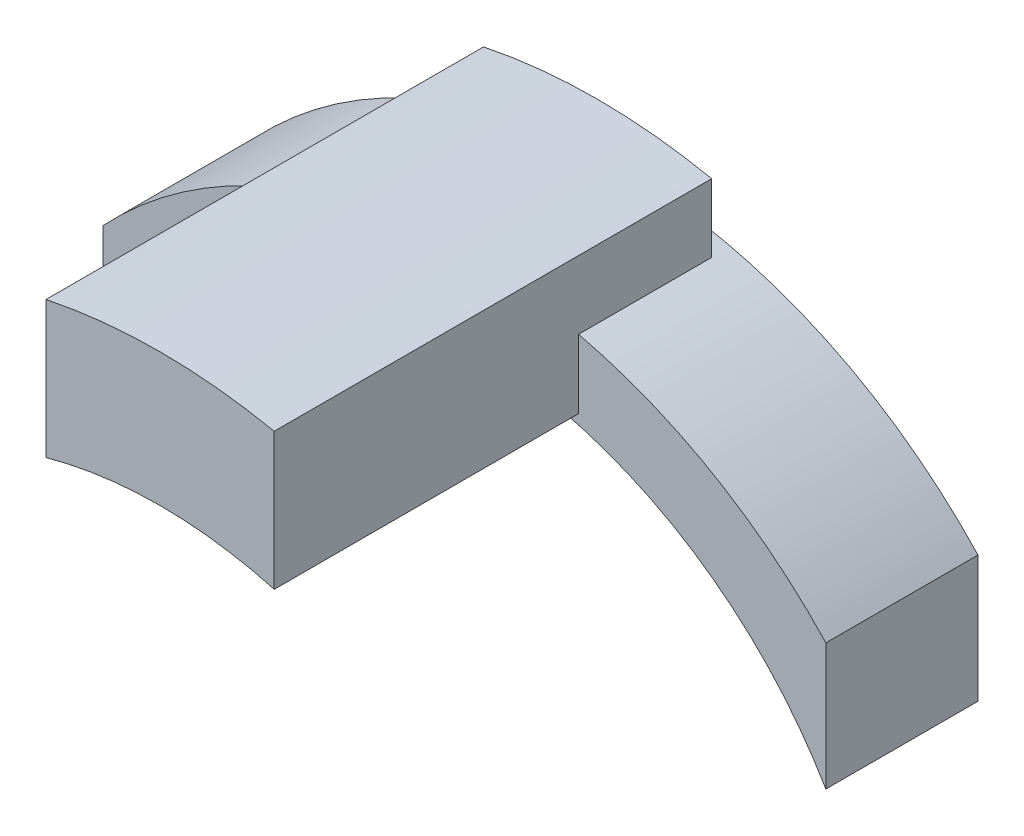
ISO-10303-21;
HEADER;
FILE_DESCRIPTION(('STEP AP214'),'2;1');
FILE_NAME('part.step','',(''),(''),'','','');
FILE_SCHEMA(('AUTOMOTIVE_DESIGN { 1 0 10303 214 1 1 1 1 }'));
ENDSEC;
DATA;
#1=APPLICATION_CONTEXT('core data for automotive mechanical design processes');
#2=APPLICATION_PROTOCOL_DEFINITION('international standard','automotive_design',2000,#1);
#3=PRODUCT_CONTEXT('',#1,'mechanical');
#4=PRODUCT('Part','Part','',(#3));
#5=PRODUCT_RELATED_PRODUCT_CATEGORY('part','',(#4));
#6=PRODUCT_DEFINITION_FORMATION('','',#4);
#7=PRODUCT_DEFINITION_CONTEXT('part definition',#1,'design');
#8=PRODUCT_DEFINITION('design','',#6,#7);
#9=PRODUCT_DEFINITION_SHAPE('','',#8);
#10=(LENGTH_UNIT() NAMED_UNIT(*) SI_UNIT(.MILLI.,.METRE.));
#11=(NAMED_UNIT(*) PLANE_ANGLE_UNIT() SI_UNIT($,.RADIAN.));
#12=(NAMED_UNIT(*) SI_UNIT($,.STERADIAN.) SOLID_ANGLE_UNIT());
#13=UNCERTAINTY_MEASURE_WITH_UNIT(LENGTH_MEASURE(1.E-05),#10,'distance_accuracy_value','');
#14=(GEOMETRIC_REPRESENTATION_CONTEXT(3) GLOBAL_UNCERTAINTY_ASSIGNED_CONTEXT((#13)) GLOBAL_UNIT_ASSIGNED_CONTEXT((#10,
#11,#12)) REPRESENTATION_CONTEXT('',''));
#15=CARTESIAN_POINT('',(0.,0.,0.));
#16=DIRECTION('',(0.,0.,1.));
#17=DIRECTION('',(1.,0.,0.));
#18=AXIS2_PLACEMENT_3D('',#15,#16,#17);
#19=CARTESIAN_POINT('',(0.,0.,4.));
#20=DIRECTION('',(0.,0.,-1.));
#21=DIRECTION('',(-1.,0.,0.));
#22=AXIS2_PLACEMENT_3D('',#19,#20,#21);
#23=CYLINDRICAL_SURFACE('',#22,26.);
#24=DIRECTION('',(0.,0.,-1.));
#25=VECTOR('',#24,1.);
#26=CARTESIAN_POINT('',(-5.99999999999999,25.298221281347,4.));
#27=LINE('',#26,#25);
#28=CARTESIAN_POINT('',(-5.99999999999999,25.298221281347,-3.));
#29=VERTEX_POINT('',#28);
#30=CARTESIAN_POINT('',(-5.99999999999999,25.298221281347,4.));
#31=VERTEX_POINT('',#30);
#32=EDGE_CURVE('E172',#29,#31,#27,.F.);
#33=ORIENTED_EDGE('',*,*,#32,.F.);
#34=CARTESIAN_POINT('',(0.,0.,-3.));
#35=DIRECTION('',(0.,0.,-1.));
#36=DIRECTION('',(-1.,0.,0.));
#37=AXIS2_PLACEMENT_3D('',#34,#35,#36);
#38=CIRCLE('',#37,26.);
#39=CARTESIAN_POINT('',(6.00000000000001,25.298221281347,-3.));
#40=VERTEX_POINT('',#39);
#41=EDGE_CURVE('E11',#29,#40,#38,.T.);
#42=ORIENTED_EDGE('',*,*,#41,.T.);
#43=DIRECTION('',(0.,0.,-1.));
#44=VECTOR('',#43,1.);
#45=CARTESIAN_POINT('',(6.00000000000001,25.298221281347,4.));
#46=LINE('',#45,#44);
#47=CARTESIAN_POINT('',(6.00000000000001,25.298221281347,4.));
#48=VERTEX_POINT('',#47);
#49=EDGE_CURVE('E142',#48,#40,#46,.T.);
#50=ORIENTED_EDGE('',*,*,#49,.F.);
#51=CARTESIAN_POINT('',(0.,0.,4.));
#52=DIRECTION('',(0.,0.,1.));
#53=DIRECTION('',(1.,0.,0.));
#54=AXIS2_PLACEMENT_3D('',#51,#52,#53);
#55=CIRCLE('',#54,26.);
#56=CARTESIAN_POINT('',(19.,17.7482393492988,4.));
#57=VERTEX_POINT('',#56);
#58=EDGE_CURVE('E179',#57,#48,#55,.T.);
#59=ORIENTED_EDGE('',*,*,#58,.F.);
#60=DIRECTION('',(0.,0.,-1.));
#61=VECTOR('',#60,1.);
#62=CARTESIAN_POINT('',(19.,17.7482393492988,4.));
#63=LINE('',#62,#61);
#64=CARTESIAN_POINT('',(19.,17.7482393492988,-4.));
#65=VERTEX_POINT('',#64);
#66=EDGE_CURVE('E194',#57,#65,#63,.T.);
#67=ORIENTED_EDGE('',*,*,#66,.T.);
#68=CARTESIAN_POINT('',(0.,0.,-4.));
#69=DIRECTION('',(0.,0.,1.));
#70=DIRECTION('',(1.,0.,0.));
#71=AXIS2_PLACEMENT_3D('',#68,#69,#70);
#72=CIRCLE('',#71,26.);
#73=CARTESIAN_POINT('',(-19.,17.7482393492988,-4.));
#74=VERTEX_POINT('',#73);
#75=EDGE_CURVE('E188',#65,#74,#72,.T.);
#76=ORIENTED_EDGE('',*,*,#75,.T.);
#77=DIRECTION('',(0.,0.,-1.));
#78=VECTOR('',#77,1.);
#79=CARTESIAN_POINT('',(-19.,17.7482393492988,4.));
#80=LINE('',#79,#78);
#81=CARTESIAN_POINT('',(-19.,17.7482393492988,4.));
#82=VERTEX_POINT('',#81);
#83=EDGE_CURVE('E192',#82,#74,#80,.T.);
#84=ORIENTED_EDGE('',*,*,#83,.F.);
#85=EDGE_CURVE('E178',#31,#82,#55,.T.);
#86=ORIENTED_EDGE('',*,*,#85,.F.);
#87=EDGE_LOOP('',(#33,#42,#50,#59,#67,#76,#84,#86));
#88=FACE_BOUND('',#87,.T.);
#89=ADVANCED_FACE('F44',(#88),#23,.T.);
#90=CARTESIAN_POINT('',(0.,0.,4.));
#91=DIRECTION('',(0.,0.,1.));
#92=DIRECTION('',(1.,0.,0.));
#93=AXIS2_PLACEMENT_3D('',#90,#91,#92);
#94=PLANE('',#93);
#95=CARTESIAN_POINT('',(0.,0.,4.));
#96=DIRECTION('',(0.,0.,1.));
#97=DIRECTION('',(1.,0.,0.));
#98=AXIS2_PLACEMENT_3D('',#95,#96,#97);
#99=CIRCLE('',#98,22.5);
#100=CARTESIAN_POINT('',(6.00000000000001,21.6852484422014,4.));
#101=VERTEX_POINT('',#100);
#102=CARTESIAN_POINT('',(-5.99999999999999,21.6852484422014,4.));
#103=VERTEX_POINT('',#102);
#104=EDGE_CURVE('E202',#101,#103,#99,.T.);
#105=ORIENTED_EDGE('',*,*,#104,.T.);
#106=DIRECTION('',(0.,1.,0.));
#107=VECTOR('',#106,1.);
#108=CARTESIAN_POINT('',(-5.99999999999999,0.,4.));
#109=LINE('',#108,#107);
#110=EDGE_CURVE('E53',#103,#31,#109,.T.);
#111=ORIENTED_EDGE('',*,*,#110,.T.);
#112=ORIENTED_EDGE('',*,*,#85,.T.);
#113=DIRECTION('',(0.,-1.,0.));
#114=VECTOR('',#113,1.);
#115=CARTESIAN_POINT('',(-19.,11.0905365064094,4.));
#116=LINE('',#115,#114);
#117=CARTESIAN_POINT('',(-19.,11.0905365064094,4.));
#118=VERTEX_POINT('',#117);
#119=EDGE_CURVE('E69',#82,#118,#116,.T.);
#120=ORIENTED_EDGE('',*,*,#119,.T.);
#121=CARTESIAN_POINT('',(0.,0.,4.));
#122=DIRECTION('',(0.,0.,-1.));
#123=DIRECTION('',(1.,0.,0.));
#124=AXIS2_PLACEMENT_3D('',#121,#122,#123);
#125=CIRCLE('',#124,22.);
#126=CARTESIAN_POINT('',(19.,11.0905365064094,4.));
#127=VERTEX_POINT('',#126);
#128=EDGE_CURVE('E175',#118,#127,#125,.T.);
#129=ORIENTED_EDGE('',*,*,#128,.T.);
#130=DIRECTION('',(0.,1.,0.));
#131=VECTOR('',#130,1.);
#132=CARTESIAN_POINT('',(19.,17.7482393492988,4.));
#133=LINE('',#132,#131);
#134=EDGE_CURVE('E98',#127,#57,#133,.T.);
#135=ORIENTED_EDGE('',*,*,#134,.T.);
#136=ORIENTED_EDGE('',*,*,#58,.T.);
#137=DIRECTION('',(0.,-1.,0.));
#138=VECTOR('',#137,1.);
#139=CARTESIAN_POINT('',(6.00000000000001,0.,4.));
#140=LINE('',#139,#138);
#141=EDGE_CURVE('E199',#48,#101,#140,.T.);
#142=ORIENTED_EDGE('',*,*,#141,.T.);
#143=EDGE_LOOP('',(#105,#111,#112,#120,#129,#135,#136,#142));
#144=FACE_BOUND('',#143,.T.);
#145=ADVANCED_FACE('F204',(#144),#94,.T.);
#146=CARTESIAN_POINT('',(0.,0.,4.));
#147=DIRECTION('',(0.,0.,-1.));
#148=DIRECTION('',(-1.,0.,0.));
#149=AXIS2_PLACEMENT_3D('',#146,#147,#148);
#150=CYLINDRICAL_SURFACE('',#149,22.);
#151=CARTESIAN_POINT('',(0.,0.,-4.));
#152=DIRECTION('',(0.,0.,-1.));
#153=DIRECTION('',(1.,0.,0.));
#154=AXIS2_PLACEMENT_3D('',#151,#152,#153);
#155=CIRCLE('',#154,22.);
#156=CARTESIAN_POINT('',(-19.,11.0905365064094,-4.));
#157=VERTEX_POINT('',#156);
#158=CARTESIAN_POINT('',(19.,11.0905365064094,-4.));
#159=VERTEX_POINT('',#158);
#160=EDGE_CURVE('E174',#157,#159,#155,.T.);
#161=ORIENTED_EDGE('',*,*,#160,.T.);
#162=DIRECTION('',(0.,0.,-1.));
#163=VECTOR('',#162,1.);
#164=CARTESIAN_POINT('',(19.,11.0905365064094,4.));
#165=LINE('',#164,#163);
#166=EDGE_CURVE('E197',#127,#159,#165,.T.);
#167=ORIENTED_EDGE('',*,*,#166,.F.);
#168=ORIENTED_EDGE('',*,*,#128,.F.);
#169=DIRECTION('',(0.,0.,-1.));
#170=VECTOR('',#169,1.);
#171=CARTESIAN_POINT('',(-19.,11.0905365064094,4.));
#172=LINE('',#171,#170);
#173=EDGE_CURVE('E183',#118,#157,#172,.T.);
#174=ORIENTED_EDGE('',*,*,#173,.T.);
#175=EDGE_LOOP('',(#161,#167,#168,#174));
#176=FACE_BOUND('',#175,.T.);
#177=ADVANCED_FACE('F47',(#176),#150,.F.);
#178=CARTESIAN_POINT('',(19.,17.7482393492988,4.));
#179=DIRECTION('',(-1.,0.,0.));
#180=DIRECTION('',(0.,0.,1.));
#181=AXIS2_PLACEMENT_3D('',#178,#179,#180);
#182=PLANE('',#181);
#183=DIRECTION('',(0.,1.,0.));
#184=VECTOR('',#183,1.);
#185=CARTESIAN_POINT('',(19.,17.7482393492988,-4.));
#186=LINE('',#185,#184);
#187=EDGE_CURVE('E186',#159,#65,#186,.T.);
#188=ORIENTED_EDGE('',*,*,#187,.T.);
#189=ORIENTED_EDGE('',*,*,#66,.F.);
#190=ORIENTED_EDGE('',*,*,#134,.F.);
#191=ORIENTED_EDGE('',*,*,#166,.T.);
#192=EDGE_LOOP('',(#188,#189,#190,#191));
#193=FACE_BOUND('',#192,.T.);
#194=ADVANCED_FACE('F215',(#193),#182,.F.);
#195=CARTESIAN_POINT('',(-19.,11.0905365064094,4.));
#196=DIRECTION('',(1.,0.,0.));
#197=DIRECTION('',(0.,0.,-1.));
#198=AXIS2_PLACEMENT_3D('',#195,#196,#197);
#199=PLANE('',#198);
#200=DIRECTION('',(0.,-1.,0.));
#201=VECTOR('',#200,1.);
#202=CARTESIAN_POINT('',(-19.,11.0905365064094,-4.));
#203=LINE('',#202,#201);
#204=EDGE_CURVE('E90',#74,#157,#203,.T.);
#205=ORIENTED_EDGE('',*,*,#204,.T.);
#206=ORIENTED_EDGE('',*,*,#173,.F.);
#207=ORIENTED_EDGE('',*,*,#119,.F.);
#208=ORIENTED_EDGE('',*,*,#83,.T.);
#209=EDGE_LOOP('',(#205,#206,#207,#208));
#210=FACE_BOUND('',#209,.T.);
#211=ADVANCED_FACE('F209',(#210),#199,.F.);
#212=CARTESIAN_POINT('',(0.,0.,-4.));
#213=DIRECTION('',(0.,0.,1.));
#214=DIRECTION('',(1.,0.,0.));
#215=AXIS2_PLACEMENT_3D('',#212,#213,#214);
#216=PLANE('',#215);
#217=ORIENTED_EDGE('',*,*,#160,.F.);
#218=ORIENTED_EDGE('',*,*,#204,.F.);
#219=ORIENTED_EDGE('',*,*,#75,.F.);
#220=ORIENTED_EDGE('',*,*,#187,.F.);
#221=EDGE_LOOP('',(#217,#218,#219,#220));
#222=FACE_BOUND('',#221,.T.);
#223=ADVANCED_FACE('F248',(#222),#216,.F.);
#224=CARTESIAN_POINT('',(0.,0.,-3.));
#225=DIRECTION('',(0.,0.,-1.));
#226=DIRECTION('',(-1.,0.,0.));
#227=AXIS2_PLACEMENT_3D('',#224,#225,#226);
#228=PLANE('',#227);
#229=ORIENTED_EDGE('',*,*,#41,.F.);
#230=DIRECTION('',(0.,1.,0.));
#231=VECTOR('',#230,1.);
#232=CARTESIAN_POINT('',(-5.99999999999999,21.6852484422014,-3.));
#233=LINE('',#232,#231);
#234=CARTESIAN_POINT('',(-5.99999999999999,28.8833862280724,-3.));
#235=VERTEX_POINT('',#234);
#236=EDGE_CURVE('E160',#29,#235,#233,.T.);
#237=ORIENTED_EDGE('',*,*,#236,.T.);
#238=CARTESIAN_POINT('',(0.,0.,-3.));
#239=DIRECTION('',(0.,0.,-1.));
#240=DIRECTION('',(-1.,0.,0.));
#241=AXIS2_PLACEMENT_3D('',#238,#239,#240);
#242=CIRCLE('',#241,29.5);
#243=CARTESIAN_POINT('',(6.00000000000001,28.8833862280724,-3.));
#244=VERTEX_POINT('',#243);
#245=EDGE_CURVE('E162',#235,#244,#242,.T.);
#246=ORIENTED_EDGE('',*,*,#245,.T.);
#247=DIRECTION('',(0.,-1.,0.));
#248=VECTOR('',#247,1.);
#249=CARTESIAN_POINT('',(6.00000000000001,28.8833862280724,-3.));
#250=LINE('',#249,#248);
#251=EDGE_CURVE('E164',#244,#40,#250,.T.);
#252=ORIENTED_EDGE('',*,*,#251,.T.);
#253=EDGE_LOOP('',(#229,#237,#246,#252));
#254=FACE_BOUND('',#253,.T.);
#255=ADVANCED_FACE('F220',(#254),#228,.T.);
#256=CARTESIAN_POINT('',(-5.99999999999999,21.6852484422014,-3.));
#257=DIRECTION('',(1.,0.,0.));
#258=DIRECTION('',(0.,0.,-1.));
#259=AXIS2_PLACEMENT_3D('',#256,#257,#258);
#260=PLANE('',#259);
#261=ORIENTED_EDGE('',*,*,#236,.F.);
#262=ORIENTED_EDGE('',*,*,#32,.T.);
#263=ORIENTED_EDGE('',*,*,#110,.F.);
#264=DIRECTION('',(0.,0.,1.));
#265=VECTOR('',#264,1.);
#266=CARTESIAN_POINT('',(-5.99999999999999,21.6852484422014,-3.));
#267=LINE('',#266,#265);
#268=CARTESIAN_POINT('',(-5.99999999999999,21.6852484422014,20.));
#269=VERTEX_POINT('',#268);
#270=EDGE_CURVE('E132',#103,#269,#267,.T.);
#271=ORIENTED_EDGE('',*,*,#270,.T.);
#272=DIRECTION('',(0.,1.,0.));
#273=VECTOR('',#272,1.);
#274=CARTESIAN_POINT('',(-5.99999999999999,21.6852484422014,20.));
#275=LINE('',#274,#273);
#276=CARTESIAN_POINT('',(-5.99999999999999,28.8833862280724,20.));
#277=VERTEX_POINT('',#276);
#278=EDGE_CURVE('E137',#269,#277,#275,.T.);
#279=ORIENTED_EDGE('',*,*,#278,.T.);
#280=DIRECTION('',(0.,0.,1.));
#281=VECTOR('',#280,1.);
#282=CARTESIAN_POINT('',(-5.99999999999999,28.8833862280724,-3.));
#283=LINE('',#282,#281);
#284=EDGE_CURVE('E143',#235,#277,#283,.T.);
#285=ORIENTED_EDGE('',*,*,#284,.F.);
#286=EDGE_LOOP('',(#261,#262,#263,#271,#279,#285));
#287=FACE_BOUND('',#286,.T.);
#288=ADVANCED_FACE('F135',(#287),#260,.F.);
#289=CARTESIAN_POINT('',(6.00000000000001,28.8833862280724,-3.));
#290=DIRECTION('',(-1.,0.,0.));
#291=DIRECTION('',(0.,0.,1.));
#292=AXIS2_PLACEMENT_3D('',#289,#290,#291);
#293=PLANE('',#292);
#294=ORIENTED_EDGE('',*,*,#141,.F.);
#295=ORIENTED_EDGE('',*,*,#49,.T.);
#296=ORIENTED_EDGE('',*,*,#251,.F.);
#297=DIRECTION('',(0.,0.,1.));
#298=VECTOR('',#297,1.);
#299=CARTESIAN_POINT('',(6.00000000000001,28.8833862280724,-3.));
#300=LINE('',#299,#298);
#301=CARTESIAN_POINT('',(6.00000000000001,28.8833862280724,20.));
#302=VERTEX_POINT('',#301);
#303=EDGE_CURVE('E168',#244,#302,#300,.T.);
#304=ORIENTED_EDGE('',*,*,#303,.T.);
#305=DIRECTION('',(0.,-1.,0.));
#306=VECTOR('',#305,1.);
#307=CARTESIAN_POINT('',(6.00000000000001,28.8833862280724,20.));
#308=LINE('',#307,#306);
#309=CARTESIAN_POINT('',(6.00000000000001,21.6852484422014,20.));
#310=VERTEX_POINT('',#309);
#311=EDGE_CURVE('E158',#302,#310,#308,.T.);
#312=ORIENTED_EDGE('',*,*,#311,.T.);
#313=DIRECTION('',(0.,0.,1.));
#314=VECTOR('',#313,1.);
#315=CARTESIAN_POINT('',(6.00000000000001,21.6852484422014,-3.));
#316=LINE('',#315,#314);
#317=EDGE_CURVE('E60',#101,#310,#316,.T.);
#318=ORIENTED_EDGE('',*,*,#317,.F.);
#319=EDGE_LOOP('',(#294,#295,#296,#304,#312,#318));
#320=FACE_BOUND('',#319,.T.);
#321=ADVANCED_FACE('F218',(#320),#293,.F.);
#322=CARTESIAN_POINT('',(0.,0.,-3.));
#323=DIRECTION('',(0.,0.,1.));
#324=DIRECTION('',(1.,0.,0.));
#325=AXIS2_PLACEMENT_3D('',#322,#323,#324);
#326=CYLINDRICAL_SURFACE('',#325,22.5);
#327=ORIENTED_EDGE('',*,*,#104,.F.);
#328=ORIENTED_EDGE('',*,*,#317,.T.);
#329=CARTESIAN_POINT('',(0.,0.,20.));
#330=DIRECTION('',(0.,0.,1.));
#331=DIRECTION('',(-1.,0.,0.));
#332=AXIS2_PLACEMENT_3D('',#329,#330,#331);
#333=CIRCLE('',#332,22.5);
#334=EDGE_CURVE('E150',#310,#269,#333,.T.);
#335=ORIENTED_EDGE('',*,*,#334,.T.);
#336=ORIENTED_EDGE('',*,*,#270,.F.);
#337=EDGE_LOOP('',(#327,#328,#335,#336));
#338=FACE_BOUND('',#337,.T.);
#339=ADVANCED_FACE('F154',(#338),#326,.F.);
#340=CARTESIAN_POINT('',(0.,0.,-3.));
#341=DIRECTION('',(0.,0.,1.));
#342=DIRECTION('',(1.,0.,0.));
#343=AXIS2_PLACEMENT_3D('',#340,#341,#342);
#344=CYLINDRICAL_SURFACE('',#343,29.5);
#345=ORIENTED_EDGE('',*,*,#284,.T.);
#346=CARTESIAN_POINT('',(0.,0.,20.));
#347=DIRECTION('',(0.,0.,-1.));
#348=DIRECTION('',(-1.,0.,0.));
#349=AXIS2_PLACEMENT_3D('',#346,#347,#348);
#350=CIRCLE('',#349,29.5);
#351=EDGE_CURVE('E152',#277,#302,#350,.T.);
#352=ORIENTED_EDGE('',*,*,#351,.T.);
#353=ORIENTED_EDGE('',*,*,#303,.F.);
#354=ORIENTED_EDGE('',*,*,#245,.F.);
#355=EDGE_LOOP('',(#345,#352,#353,#354));
#356=FACE_BOUND('',#355,.T.);
#357=ADVANCED_FACE('F224',(#356),#344,.T.);
#358=CARTESIAN_POINT('',(0.,0.,20.));
#359=DIRECTION('',(0.,0.,-1.));
#360=DIRECTION('',(-1.,0.,0.));
#361=AXIS2_PLACEMENT_3D('',#358,#359,#360);
#362=PLANE('',#361);
#363=ORIENTED_EDGE('',*,*,#334,.F.);
#364=ORIENTED_EDGE('',*,*,#311,.F.);
#365=ORIENTED_EDGE('',*,*,#351,.F.);
#366=ORIENTED_EDGE('',*,*,#278,.F.);
#367=EDGE_LOOP('',(#363,#364,#365,#366));
#368=FACE_BOUND('',#367,.T.);
#369=ADVANCED_FACE('F148',(#368),#362,.F.);
#370=CLOSED_SHELL('',(#89,#145,#177,#194,#211,#223,#255,#288,#321,#339,#357,#369));
#371=MANIFOLD_SOLID_BREP('B2',#370);
#372=ADVANCED_BREP_SHAPE_REPRESENTATION('',(#18,#371),#14);
#373=SHAPE_DEFINITION_REPRESENTATION(#9,#372);
ENDSEC;
END-ISO-10303-21;
